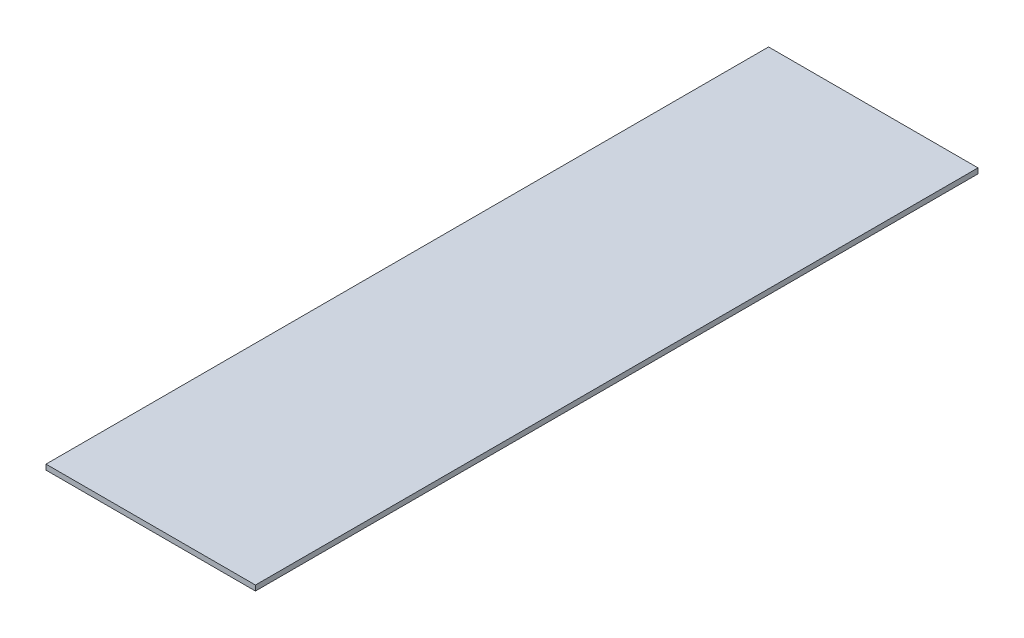
ISO-10303-21;
HEADER;
FILE_DESCRIPTION(('STEP AP214'),'2;1');
FILE_NAME('part.step','',(''),(''),'','','');
FILE_SCHEMA(('AUTOMOTIVE_DESIGN { 1 0 10303 214 1 1 1 1 }'));
ENDSEC;
DATA;
#1=APPLICATION_CONTEXT('core data for automotive mechanical design processes');
#2=APPLICATION_PROTOCOL_DEFINITION('international standard','automotive_design',2000,#1);
#3=PRODUCT_CONTEXT('',#1,'mechanical');
#4=PRODUCT('Part','Part','',(#3));
#5=PRODUCT_RELATED_PRODUCT_CATEGORY('part','',(#4));
#6=PRODUCT_DEFINITION_FORMATION('','',#4);
#7=PRODUCT_DEFINITION_CONTEXT('part definition',#1,'design');
#8=PRODUCT_DEFINITION('design','',#6,#7);
#9=PRODUCT_DEFINITION_SHAPE('','',#8);
#10=(LENGTH_UNIT() NAMED_UNIT(*) SI_UNIT(.MILLI.,.METRE.));
#11=(NAMED_UNIT(*) PLANE_ANGLE_UNIT() SI_UNIT($,.RADIAN.));
#12=(NAMED_UNIT(*) SI_UNIT($,.STERADIAN.) SOLID_ANGLE_UNIT());
#13=UNCERTAINTY_MEASURE_WITH_UNIT(LENGTH_MEASURE(1.E-05),#10,'distance_accuracy_value','');
#14=(GEOMETRIC_REPRESENTATION_CONTEXT(3) GLOBAL_UNCERTAINTY_ASSIGNED_CONTEXT((#13)) GLOBAL_UNIT_ASSIGNED_CONTEXT((#10,
#11,#12)) REPRESENTATION_CONTEXT('',''));
#15=CARTESIAN_POINT('',(0.,0.,0.));
#16=DIRECTION('',(0.,0.,1.));
#17=DIRECTION('',(1.,0.,0.));
#18=AXIS2_PLACEMENT_3D('',#15,#16,#17);
#19=CARTESIAN_POINT('',(100.,2.5,345.));
#20=DIRECTION('',(-1.,0.,0.));
#21=DIRECTION('',(0.,0.,1.));
#22=AXIS2_PLACEMENT_3D('',#19,#20,#21);
#23=PLANE('',#22);
#24=DIRECTION('',(0.,1.,0.));
#25=VECTOR('',#24,1.);
#26=CARTESIAN_POINT('',(100.,2.5,-345.));
#27=LINE('',#26,#25);
#28=CARTESIAN_POINT('',(100.,-2.5,-345.));
#29=VERTEX_POINT('',#28);
#30=CARTESIAN_POINT('',(100.,2.5,-345.));
#31=VERTEX_POINT('',#30);
#32=EDGE_CURVE('E97',#29,#31,#27,.T.);
#33=ORIENTED_EDGE('',*,*,#32,.T.);
#34=DIRECTION('',(0.,0.,-1.));
#35=VECTOR('',#34,1.);
#36=CARTESIAN_POINT('',(100.,2.5,345.));
#37=LINE('',#36,#35);
#38=CARTESIAN_POINT('',(100.,2.5,345.));
#39=VERTEX_POINT('',#38);
#40=EDGE_CURVE('E11',#39,#31,#37,.T.);
#41=ORIENTED_EDGE('',*,*,#40,.F.);
#42=DIRECTION('',(0.,1.,0.));
#43=VECTOR('',#42,1.);
#44=CARTESIAN_POINT('',(100.,2.5,345.));
#45=LINE('',#44,#43);
#46=CARTESIAN_POINT('',(100.,-2.5,345.));
#47=VERTEX_POINT('',#46);
#48=EDGE_CURVE('E85',#47,#39,#45,.T.);
#49=ORIENTED_EDGE('',*,*,#48,.F.);
#50=DIRECTION('',(0.,0.,-1.));
#51=VECTOR('',#50,1.);
#52=CARTESIAN_POINT('',(100.,-2.5,345.));
#53=LINE('',#52,#51);
#54=EDGE_CURVE('E93',#47,#29,#53,.T.);
#55=ORIENTED_EDGE('',*,*,#54,.T.);
#56=EDGE_LOOP('',(#33,#41,#49,#55));
#57=FACE_BOUND('',#56,.T.);
#58=ADVANCED_FACE('F34',(#57),#23,.F.);
#59=CARTESIAN_POINT('',(-100.,2.5,345.));
#60=DIRECTION('',(0.,-1.,0.));
#61=DIRECTION('',(0.,0.,-1.));
#62=AXIS2_PLACEMENT_3D('',#59,#60,#61);
#63=PLANE('',#62);
#64=DIRECTION('',(-1.,0.,0.));
#65=VECTOR('',#64,1.);
#66=CARTESIAN_POINT('',(-100.,2.5,-345.));
#67=LINE('',#66,#65);
#68=CARTESIAN_POINT('',(-100.,2.5,-345.));
#69=VERTEX_POINT('',#68);
#70=EDGE_CURVE('E89',#31,#69,#67,.T.);
#71=ORIENTED_EDGE('',*,*,#70,.T.);
#72=DIRECTION('',(0.,0.,-1.));
#73=VECTOR('',#72,1.);
#74=CARTESIAN_POINT('',(-100.,2.5,345.));
#75=LINE('',#74,#73);
#76=CARTESIAN_POINT('',(-100.,2.5,345.));
#77=VERTEX_POINT('',#76);
#78=EDGE_CURVE('E42',#77,#69,#75,.T.);
#79=ORIENTED_EDGE('',*,*,#78,.F.);
#80=DIRECTION('',(-1.,0.,0.));
#81=VECTOR('',#80,1.);
#82=CARTESIAN_POINT('',(-100.,2.5,345.));
#83=LINE('',#82,#81);
#84=EDGE_CURVE('E80',#39,#77,#83,.T.);
#85=ORIENTED_EDGE('',*,*,#84,.F.);
#86=ORIENTED_EDGE('',*,*,#40,.T.);
#87=EDGE_LOOP('',(#71,#79,#85,#86));
#88=FACE_BOUND('',#87,.T.);
#89=ADVANCED_FACE('F88',(#88),#63,.F.);
#90=CARTESIAN_POINT('',(-100.,2.5,345.));
#91=DIRECTION('',(1.,0.,0.));
#92=DIRECTION('',(0.,0.,-1.));
#93=AXIS2_PLACEMENT_3D('',#90,#91,#92);
#94=PLANE('',#93);
#95=DIRECTION('',(0.,-1.,0.));
#96=VECTOR('',#95,1.);
#97=CARTESIAN_POINT('',(-100.,2.5,-345.));
#98=LINE('',#97,#96);
#99=CARTESIAN_POINT('',(-100.,-2.5,-345.));
#100=VERTEX_POINT('',#99);
#101=EDGE_CURVE('E67',#69,#100,#98,.T.);
#102=ORIENTED_EDGE('',*,*,#101,.T.);
#103=DIRECTION('',(0.,0.,-1.));
#104=VECTOR('',#103,1.);
#105=CARTESIAN_POINT('',(-100.,-2.5,345.));
#106=LINE('',#105,#104);
#107=CARTESIAN_POINT('',(-100.,-2.5,345.));
#108=VERTEX_POINT('',#107);
#109=EDGE_CURVE('E90',#108,#100,#106,.T.);
#110=ORIENTED_EDGE('',*,*,#109,.F.);
#111=DIRECTION('',(0.,-1.,0.));
#112=VECTOR('',#111,1.);
#113=CARTESIAN_POINT('',(-100.,2.5,345.));
#114=LINE('',#113,#112);
#115=EDGE_CURVE('E83',#77,#108,#114,.T.);
#116=ORIENTED_EDGE('',*,*,#115,.F.);
#117=ORIENTED_EDGE('',*,*,#78,.T.);
#118=EDGE_LOOP('',(#102,#110,#116,#117));
#119=FACE_BOUND('',#118,.T.);
#120=ADVANCED_FACE('F91',(#119),#94,.F.);
#121=CARTESIAN_POINT('',(-100.,-2.5,345.));
#122=DIRECTION('',(0.,1.,0.));
#123=DIRECTION('',(0.,0.,1.));
#124=AXIS2_PLACEMENT_3D('',#121,#122,#123);
#125=PLANE('',#124);
#126=DIRECTION('',(1.,0.,0.));
#127=VECTOR('',#126,1.);
#128=CARTESIAN_POINT('',(-100.,-2.5,-345.));
#129=LINE('',#128,#127);
#130=EDGE_CURVE('E73',#100,#29,#129,.T.);
#131=ORIENTED_EDGE('',*,*,#130,.T.);
#132=ORIENTED_EDGE('',*,*,#54,.F.);
#133=DIRECTION('',(1.,0.,0.));
#134=VECTOR('',#133,1.);
#135=CARTESIAN_POINT('',(-100.,-2.5,345.));
#136=LINE('',#135,#134);
#137=EDGE_CURVE('E50',#108,#47,#136,.T.);
#138=ORIENTED_EDGE('',*,*,#137,.F.);
#139=ORIENTED_EDGE('',*,*,#109,.T.);
#140=EDGE_LOOP('',(#131,#132,#138,#139));
#141=FACE_BOUND('',#140,.T.);
#142=ADVANCED_FACE('F104',(#141),#125,.F.);
#143=CARTESIAN_POINT('',(0.,0.,345.));
#144=DIRECTION('',(0.,0.,1.));
#145=DIRECTION('',(1.,0.,0.));
#146=AXIS2_PLACEMENT_3D('',#143,#144,#145);
#147=PLANE('',#146);
#148=ORIENTED_EDGE('',*,*,#48,.T.);
#149=ORIENTED_EDGE('',*,*,#84,.T.);
#150=ORIENTED_EDGE('',*,*,#115,.T.);
#151=ORIENTED_EDGE('',*,*,#137,.T.);
#152=EDGE_LOOP('',(#148,#149,#150,#151));
#153=FACE_BOUND('',#152,.T.);
#154=ADVANCED_FACE('F81',(#153),#147,.T.);
#155=CARTESIAN_POINT('',(0.,0.,-345.));
#156=DIRECTION('',(0.,0.,1.));
#157=DIRECTION('',(1.,0.,0.));
#158=AXIS2_PLACEMENT_3D('',#155,#156,#157);
#159=PLANE('',#158);
#160=ORIENTED_EDGE('',*,*,#32,.F.);
#161=ORIENTED_EDGE('',*,*,#130,.F.);
#162=ORIENTED_EDGE('',*,*,#101,.F.);
#163=ORIENTED_EDGE('',*,*,#70,.F.);
#164=EDGE_LOOP('',(#160,#161,#162,#163));
#165=FACE_BOUND('',#164,.T.);
#166=ADVANCED_FACE('F107',(#165),#159,.F.);
#167=CLOSED_SHELL('',(#58,#89,#120,#142,#154,#166));
#168=MANIFOLD_SOLID_BREP('B2',#167);
#169=ADVANCED_BREP_SHAPE_REPRESENTATION('',(#18,#168),#14);
#170=SHAPE_DEFINITION_REPRESENTATION(#9,#169);
ENDSEC;
END-ISO-10303-21;
